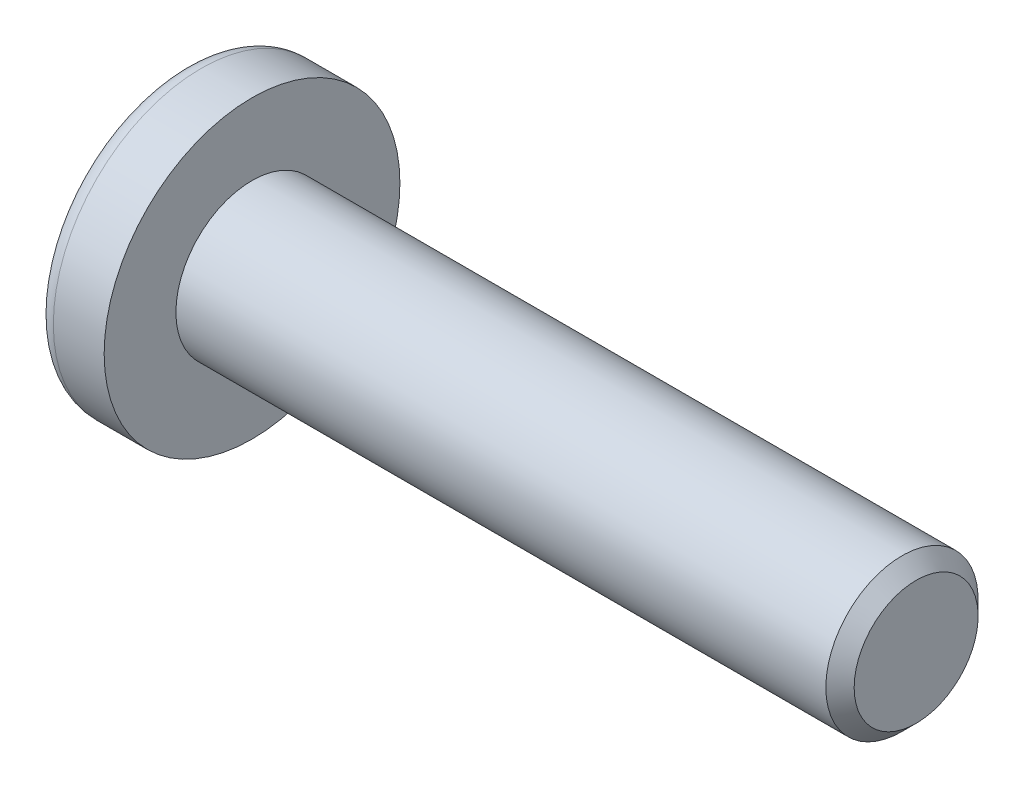
ISO-10303-21;
HEADER;
FILE_DESCRIPTION(('STEP AP214'),'2;1');
FILE_NAME('part.step','',(''),(''),'','','');
FILE_SCHEMA(('AUTOMOTIVE_DESIGN { 1 0 10303 214 1 1 1 1 }'));
ENDSEC;
DATA;
#1=APPLICATION_CONTEXT('core data for automotive mechanical design processes');
#2=APPLICATION_PROTOCOL_DEFINITION('international standard','automotive_design',2000,#1);
#3=PRODUCT_CONTEXT('',#1,'mechanical');
#4=PRODUCT('Part','Part','',(#3));
#5=PRODUCT_RELATED_PRODUCT_CATEGORY('part','',(#4));
#6=PRODUCT_DEFINITION_FORMATION('','',#4);
#7=PRODUCT_DEFINITION_CONTEXT('part definition',#1,'design');
#8=PRODUCT_DEFINITION('design','',#6,#7);
#9=PRODUCT_DEFINITION_SHAPE('','',#8);
#10=(LENGTH_UNIT() NAMED_UNIT(*) SI_UNIT(.MILLI.,.METRE.));
#11=(NAMED_UNIT(*) PLANE_ANGLE_UNIT() SI_UNIT($,.RADIAN.));
#12=(NAMED_UNIT(*) SI_UNIT($,.STERADIAN.) SOLID_ANGLE_UNIT());
#13=UNCERTAINTY_MEASURE_WITH_UNIT(LENGTH_MEASURE(1.E-05),#10,'distance_accuracy_value','');
#14=(GEOMETRIC_REPRESENTATION_CONTEXT(3) GLOBAL_UNCERTAINTY_ASSIGNED_CONTEXT((#13)) GLOBAL_UNIT_ASSIGNED_CONTEXT((#10,
#11,#12)) REPRESENTATION_CONTEXT('',''));
#15=CARTESIAN_POINT('',(0.,0.,0.));
#16=DIRECTION('',(0.,0.,1.));
#17=DIRECTION('',(1.,0.,0.));
#18=AXIS2_PLACEMENT_3D('',#15,#16,#17);
#19=CARTESIAN_POINT('',(3.49504,0.,0.));
#20=DIRECTION('',(-1.,0.,0.));
#21=DIRECTION('',(0.,1.,0.));
#22=AXIS2_PLACEMENT_3D('',#19,#20,#21);
#23=SPHERICAL_SURFACE('',#22,3.49504);
#24=CARTESIAN_POINT('',(0.638066947960321,0.,0.));
#25=DIRECTION('',(-1.,0.,0.));
#26=DIRECTION('',(0.,0.,1.));
#27=AXIS2_PLACEMENT_3D('',#24,#25,#26);
#28=CIRCLE('',#27,2.01320877742947);
#29=CARTESIAN_POINT('',(0.638066947960321,0.,2.01320877742947));
#30=VERTEX_POINT('',#29);
#31=EDGE_CURVE('E135',#30,#30,#28,.T.);
#32=ORIENTED_EDGE('',*,*,#31,.T.);
#33=EDGE_LOOP('',(#32));
#34=FACE_BOUND('',#33,.T.);
#35=CARTESIAN_POINT('',(3.48860800425343,-0.0562204072662827,0.));
#36=DIRECTION('',(-0.113665320353011,-0.99351909641891,0.));
#37=DIRECTION('',(0.99351909641891,-0.113665320353011,0.));
#38=AXIS2_PLACEMENT_3D('',#35,#36,#37);
#39=CIRCLE('',#38,3.49458187725478);
#40=CARTESIAN_POINT('',(0.227775025036725,0.316840992898337,1.19995665346604));
#41=VERTEX_POINT('',#40);
#42=CARTESIAN_POINT('',(0.033060362162214,0.339117670430593,0.339117670430593));
#43=VERTEX_POINT('',#42);
#44=EDGE_CURVE('E131',#41,#43,#39,.T.);
#45=ORIENTED_EDGE('',*,*,#44,.F.);
#46=CARTESIAN_POINT('',(2.78874832810788,0.,-0.872695468934767));
#47=DIRECTION('',(0.629103472698606,0.,0.777321568360582));
#48=DIRECTION('',(0.777321568360582,0.,-0.629103472698606));
#49=AXIS2_PLACEMENT_3D('',#46,#47,#48);
#50=CIRCLE('',#49,3.30981257691679);
#51=CARTESIAN_POINT('',(0.227775025036724,-0.316840992898345,1.19995665346604));
#52=VERTEX_POINT('',#51);
#53=EDGE_CURVE('E123',#41,#52,#50,.T.);
#54=ORIENTED_EDGE('',*,*,#53,.T.);
#55=CARTESIAN_POINT('',(3.48860800425343,0.0562204072662818,0.));
#56=DIRECTION('',(-0.11366532035301,0.99351909641891,0.));
#57=DIRECTION('',(-0.99351909641891,-0.11366532035301,0.));
#58=AXIS2_PLACEMENT_3D('',#55,#56,#57);
#59=CIRCLE('',#58,3.49458187725478);
#60=CARTESIAN_POINT('',(0.0330603621622127,-0.339117670430595,0.339117670430594));
#61=VERTEX_POINT('',#60);
#62=EDGE_CURVE('E374',#61,#52,#59,.T.);
#63=ORIENTED_EDGE('',*,*,#62,.F.);
#64=CARTESIAN_POINT('',(3.48860800425343,0.,-0.0562204072662819));
#65=DIRECTION('',(-0.11366532035301,0.,-0.99351909641891));
#66=DIRECTION('',(-0.99351909641891,0.,0.11366532035301));
#67=AXIS2_PLACEMENT_3D('',#64,#65,#66);
#68=CIRCLE('',#67,3.49458187725478);
#69=CARTESIAN_POINT('',(0.227775025036724,-1.19995665346604,0.316840992898341));
#70=VERTEX_POINT('',#69);
#71=EDGE_CURVE('E169',#70,#61,#68,.T.);
#72=ORIENTED_EDGE('',*,*,#71,.F.);
#73=CARTESIAN_POINT('',(2.78874832810788,0.872695468934764,0.));
#74=DIRECTION('',(0.629103472698606,-0.777321568360582,0.));
#75=DIRECTION('',(0.777321568360582,0.629103472698606,0.));
#76=AXIS2_PLACEMENT_3D('',#73,#74,#75);
#77=CIRCLE('',#76,3.30981257691679);
#78=CARTESIAN_POINT('',(0.227775025036722,-1.19995665346604,-0.316840992898341));
#79=VERTEX_POINT('',#78);
#80=EDGE_CURVE('E165',#70,#79,#77,.T.);
#81=ORIENTED_EDGE('',*,*,#80,.T.);
#82=CARTESIAN_POINT('',(3.48860800425343,0.,0.0562204072662826));
#83=DIRECTION('',(-0.113665320353011,0.,0.99351909641891));
#84=DIRECTION('',(0.99351909641891,0.,0.113665320353011));
#85=AXIS2_PLACEMENT_3D('',#82,#83,#84);
#86=CIRCLE('',#85,3.49458187725478);
#87=CARTESIAN_POINT('',(0.0330603621622127,-0.339117670430592,-0.339117670430594));
#88=VERTEX_POINT('',#87);
#89=EDGE_CURVE('E49',#88,#79,#86,.T.);
#90=ORIENTED_EDGE('',*,*,#89,.F.);
#91=CARTESIAN_POINT('',(0.227775025036724,-0.316840992898336,-1.19995665346604));
#92=VERTEX_POINT('',#91);
#93=EDGE_CURVE('E372',#92,#88,#59,.T.);
#94=ORIENTED_EDGE('',*,*,#93,.F.);
#95=CARTESIAN_POINT('',(2.78874832810788,0.,0.872695468934766));
#96=DIRECTION('',(0.629103472698606,0.,-0.777321568360582));
#97=DIRECTION('',(-0.777321568360582,0.,-0.629103472698606));
#98=AXIS2_PLACEMENT_3D('',#95,#96,#97);
#99=CIRCLE('',#98,3.30981257691679);
#100=CARTESIAN_POINT('',(0.227775025036724,0.316840992898345,-1.19995665346604));
#101=VERTEX_POINT('',#100);
#102=EDGE_CURVE('E379',#92,#101,#99,.T.);
#103=ORIENTED_EDGE('',*,*,#102,.T.);
#104=CARTESIAN_POINT('',(0.033060362162214,0.339117670430595,-0.339117670430594));
#105=VERTEX_POINT('',#104);
#106=EDGE_CURVE('E108',#105,#101,#39,.T.);
#107=ORIENTED_EDGE('',*,*,#106,.F.);
#108=CARTESIAN_POINT('',(0.227775025036726,1.19995665346604,-0.316840992898341));
#109=VERTEX_POINT('',#108);
#110=EDGE_CURVE('E130',#109,#105,#86,.T.);
#111=ORIENTED_EDGE('',*,*,#110,.F.);
#112=CARTESIAN_POINT('',(2.78874832810788,-0.872695468934769,0.));
#113=DIRECTION('',(0.629103472698606,0.777321568360582,0.));
#114=DIRECTION('',(-0.777321568360582,0.629103472698606,0.));
#115=AXIS2_PLACEMENT_3D('',#112,#113,#114);
#116=CIRCLE('',#115,3.30981257691679);
#117=CARTESIAN_POINT('',(0.227775025036726,1.19995665346604,0.31684099289834));
#118=VERTEX_POINT('',#117);
#119=EDGE_CURVE('E57',#109,#118,#116,.T.);
#120=ORIENTED_EDGE('',*,*,#119,.T.);
#121=EDGE_CURVE('E168',#43,#118,#68,.T.);
#122=ORIENTED_EDGE('',*,*,#121,.F.);
#123=EDGE_LOOP('',(#45,#54,#63,#72,#81,#90,#94,#103,#107,#111,#120,#122));
#124=FACE_BOUND('',#123,.T.);
#125=ADVANCED_FACE('F34',(#34,#124),#23,.T.);
#126=CARTESIAN_POINT('',(1.71044397905759,0.,-0.147213612565445));
#127=DIRECTION('',(-0.113665320353011,0.,0.99351909641891));
#128=DIRECTION('',(0.99351909641891,0.,0.113665320353011));
#129=AXIS2_PLACEMENT_3D('',#126,#127,#128);
#130=PLANE('',#129);
#131=ORIENTED_EDGE('',*,*,#110,.T.);
#132=DIRECTION('',(0.987162587649563,-0.112938092654823,0.112938092654823));
#133=VECTOR('',#132,1.);
#134=CARTESIAN_POINT('',(1.72685656853982,0.145335901056886,-0.145335901056885));
#135=LINE('',#134,#133);
#136=CARTESIAN_POINT('',(1.4986,0.171450000000001,-0.17145));
#137=VERTEX_POINT('',#136);
#138=EDGE_CURVE('E106',#105,#137,#135,.T.);
#139=ORIENTED_EDGE('',*,*,#138,.T.);
#140=DIRECTION('',(0.774265880811046,-0.626630437436058,0.0885812660249925));
#141=VECTOR('',#140,1.);
#142=CARTESIAN_POINT('',(0.,1.3843,-0.3429));
#143=LINE('',#142,#141);
#144=EDGE_CURVE('E128',#109,#137,#143,.T.);
#145=ORIENTED_EDGE('',*,*,#144,.F.);
#146=EDGE_LOOP('',(#131,#139,#145));
#147=FACE_BOUND('',#146,.T.);
#148=ADVANCED_FACE('F127',(#147),#130,.T.);
#149=DIRECTION('',(0.774265880811046,0.626630437436058,0.0885812660249925));
#150=VECTOR('',#149,1.);
#151=CARTESIAN_POINT('',(0.,-1.3843,-0.3429));
#152=LINE('',#151,#150);
#153=CARTESIAN_POINT('',(1.4986,-0.17145,-0.17145));
#154=VERTEX_POINT('',#153);
#155=EDGE_CURVE('E150',#79,#154,#152,.T.);
#156=ORIENTED_EDGE('',*,*,#155,.T.);
#157=DIRECTION('',(-0.987162587649563,-0.112938092654822,-0.112938092654823));
#158=VECTOR('',#157,1.);
#159=CARTESIAN_POINT('',(1.72685656853982,-0.145335901056885,-0.145335901056885));
#160=LINE('',#159,#158);
#161=EDGE_CURVE('E363',#154,#88,#160,.T.);
#162=ORIENTED_EDGE('',*,*,#161,.T.);
#163=ORIENTED_EDGE('',*,*,#89,.T.);
#164=EDGE_LOOP('',(#156,#162,#163));
#165=FACE_BOUND('',#164,.T.);
#166=ADVANCED_FACE('F198',(#165),#130,.T.);
#167=CARTESIAN_POINT('',(1.71044397905759,0.,0.147213612565445));
#168=DIRECTION('',(-0.11366532035301,0.,-0.99351909641891));
#169=DIRECTION('',(-0.99351909641891,0.,0.11366532035301));
#170=AXIS2_PLACEMENT_3D('',#167,#168,#169);
#171=PLANE('',#170);
#172=DIRECTION('',(0.774265880811046,-0.626630437436058,-0.0885812660249922));
#173=VECTOR('',#172,1.);
#174=CARTESIAN_POINT('',(0.,1.3843,0.342899999999999));
#175=LINE('',#174,#173);
#176=CARTESIAN_POINT('',(1.4986,0.17145,0.17145));
#177=VERTEX_POINT('',#176);
#178=EDGE_CURVE('E136',#118,#177,#175,.T.);
#179=ORIENTED_EDGE('',*,*,#178,.T.);
#180=DIRECTION('',(-0.987162587649563,0.112938092654822,0.112938092654822));
#181=VECTOR('',#180,1.);
#182=CARTESIAN_POINT('',(1.72685656853981,0.145335901056885,0.145335901056886));
#183=LINE('',#182,#181);
#184=EDGE_CURVE('E369',#177,#43,#183,.T.);
#185=ORIENTED_EDGE('',*,*,#184,.T.);
#186=ORIENTED_EDGE('',*,*,#121,.T.);
#187=EDGE_LOOP('',(#179,#185,#186));
#188=FACE_BOUND('',#187,.T.);
#189=ADVANCED_FACE('F229',(#188),#171,.T.);
#190=ORIENTED_EDGE('',*,*,#71,.T.);
#191=DIRECTION('',(0.987162587649563,0.112938092654823,-0.112938092654822));
#192=VECTOR('',#191,1.);
#193=CARTESIAN_POINT('',(1.72685656853982,-0.145335901056886,0.145335901056886));
#194=LINE('',#193,#192);
#195=CARTESIAN_POINT('',(1.4986,-0.171450000000001,0.171449999999999));
#196=VERTEX_POINT('',#195);
#197=EDGE_CURVE('E376',#61,#196,#194,.T.);
#198=ORIENTED_EDGE('',*,*,#197,.T.);
#199=DIRECTION('',(0.774265880811046,0.626630437436058,-0.0885812660249922));
#200=VECTOR('',#199,1.);
#201=CARTESIAN_POINT('',(0.,-1.3843,0.342899999999999));
#202=LINE('',#201,#200);
#203=EDGE_CURVE('E147',#70,#196,#202,.T.);
#204=ORIENTED_EDGE('',*,*,#203,.F.);
#205=EDGE_LOOP('',(#190,#198,#204));
#206=FACE_BOUND('',#205,.T.);
#207=ADVANCED_FACE('F218',(#206),#171,.T.);
#208=CARTESIAN_POINT('',(-25.4,0.,0.));
#209=DIRECTION('',(-1.,0.,0.));
#210=DIRECTION('',(0.,0.,1.));
#211=AXIS2_PLACEMENT_3D('',#208,#209,#210);
#212=CYLINDRICAL_SURFACE('',#211,1.0922);
#213=CARTESIAN_POINT('',(10.8966,0.,0.));
#214=DIRECTION('',(1.,0.,0.));
#215=DIRECTION('',(0.,0.,-1.));
#216=AXIS2_PLACEMENT_3D('',#213,#214,#215);
#217=CIRCLE('',#216,1.0922);
#218=CARTESIAN_POINT('',(10.8966,0.,1.0922));
#219=VERTEX_POINT('',#218);
#220=EDGE_CURVE('E42',#219,#219,#217,.F.);
#221=ORIENTED_EDGE('',*,*,#220,.T.);
#222=EDGE_LOOP('',(#221));
#223=FACE_BOUND('',#222,.T.);
#224=CARTESIAN_POINT('',(1.5748,0.,0.));
#225=DIRECTION('',(-1.,0.,0.));
#226=DIRECTION('',(0.,0.,1.));
#227=AXIS2_PLACEMENT_3D('',#224,#225,#226);
#228=CIRCLE('',#227,1.0922);
#229=CARTESIAN_POINT('',(1.5748,0.,1.0922));
#230=VERTEX_POINT('',#229);
#231=EDGE_CURVE('E162',#230,#230,#228,.T.);
#232=ORIENTED_EDGE('',*,*,#231,.F.);
#233=EDGE_LOOP('',(#232));
#234=FACE_BOUND('',#233,.T.);
#235=ADVANCED_FACE('F36',(#223,#234),#212,.T.);
#236=CARTESIAN_POINT('',(1.5748,1.0922,0.));
#237=DIRECTION('',(-1.,0.,0.));
#238=DIRECTION('',(0.,0.,1.));
#239=AXIS2_PLACEMENT_3D('',#236,#237,#238);
#240=PLANE('',#239);
#241=CARTESIAN_POINT('',(1.5748,0.,0.));
#242=DIRECTION('',(-1.,0.,0.));
#243=DIRECTION('',(0.,0.,1.));
#244=AXIS2_PLACEMENT_3D('',#241,#242,#243);
#245=CIRCLE('',#244,2.1209);
#246=CARTESIAN_POINT('',(1.5748,0.,2.1209));
#247=VERTEX_POINT('',#246);
#248=EDGE_CURVE('E159',#247,#247,#245,.T.);
#249=ORIENTED_EDGE('',*,*,#248,.F.);
#250=EDGE_LOOP('',(#249));
#251=FACE_BOUND('',#250,.T.);
#252=ORIENTED_EDGE('',*,*,#231,.T.);
#253=EDGE_LOOP('',(#252));
#254=FACE_BOUND('',#253,.T.);
#255=ADVANCED_FACE('F211',(#251,#254),#240,.F.);
#256=CARTESIAN_POINT('',(-25.4,0.,0.));
#257=DIRECTION('',(-1.,0.,0.));
#258=DIRECTION('',(0.,0.,1.));
#259=AXIS2_PLACEMENT_3D('',#256,#257,#258);
#260=CYLINDRICAL_SURFACE('',#259,2.1209);
#261=ORIENTED_EDGE('',*,*,#248,.T.);
#262=EDGE_LOOP('',(#261));
#263=FACE_BOUND('',#262,.T.);
#264=CARTESIAN_POINT('',(0.845695803486458,0.,0.));
#265=DIRECTION('',(-1.,0.,0.));
#266=DIRECTION('',(0.,0.,1.));
#267=AXIS2_PLACEMENT_3D('',#264,#265,#266);
#268=CIRCLE('',#267,2.1209);
#269=CARTESIAN_POINT('',(0.845695803486458,0.,2.1209));
#270=VERTEX_POINT('',#269);
#271=EDGE_CURVE('E156',#270,#270,#268,.T.);
#272=ORIENTED_EDGE('',*,*,#271,.F.);
#273=EDGE_LOOP('',(#272));
#274=FACE_BOUND('',#273,.T.);
#275=ADVANCED_FACE('F208',(#263,#274),#260,.T.);
#276=CARTESIAN_POINT('',(0.845695803486459,0.,0.));
#277=DIRECTION('',(-1.,0.,0.));
#278=DIRECTION('',(0.,0.,1.));
#279=AXIS2_PLACEMENT_3D('',#276,#277,#278);
#280=TOROIDAL_SURFACE('',#279,1.8669,0.254000000000001);
#281=ORIENTED_EDGE('',*,*,#271,.T.);
#282=EDGE_LOOP('',(#281));
#283=FACE_BOUND('',#282,.T.);
#284=ORIENTED_EDGE('',*,*,#31,.F.);
#285=EDGE_LOOP('',(#284));
#286=FACE_BOUND('',#285,.T.);
#287=ADVANCED_FACE('F205',(#283,#286),#280,.T.);
#288=CARTESIAN_POINT('',(11.0998,1.0922,0.));
#289=DIRECTION('',(1.,0.,0.));
#290=DIRECTION('',(0.,0.,-1.));
#291=AXIS2_PLACEMENT_3D('',#288,#289,#290);
#292=PLANE('',#291);
#293=CARTESIAN_POINT('',(11.0998,0.,0.));
#294=DIRECTION('',(1.,0.,0.));
#295=DIRECTION('',(0.,0.,-1.));
#296=AXIS2_PLACEMENT_3D('',#293,#294,#295);
#297=CIRCLE('',#296,0.888999999999997);
#298=CARTESIAN_POINT('',(11.0998,0.,0.888999999999998));
#299=VERTEX_POINT('',#298);
#300=EDGE_CURVE('E11',#299,#299,#297,.T.);
#301=ORIENTED_EDGE('',*,*,#300,.T.);
#302=EDGE_LOOP('',(#301));
#303=FACE_BOUND('',#302,.T.);
#304=ADVANCED_FACE('F203',(#303),#292,.T.);
#305=CARTESIAN_POINT('',(1.4986,0.17145,0.17145));
#306=DIRECTION('',(0.629103472698606,0.777321568360582,0.));
#307=DIRECTION('',(-0.777321568360582,0.629103472698606,0.));
#308=AXIS2_PLACEMENT_3D('',#305,#306,#307);
#309=PLANE('',#308);
#310=ORIENTED_EDGE('',*,*,#144,.T.);
#311=DIRECTION('',(0.,0.,-1.));
#312=VECTOR('',#311,1.);
#313=CARTESIAN_POINT('',(1.4986,0.17145,0.17145));
#314=LINE('',#313,#312);
#315=EDGE_CURVE('E122',#177,#137,#314,.T.);
#316=ORIENTED_EDGE('',*,*,#315,.F.);
#317=ORIENTED_EDGE('',*,*,#178,.F.);
#318=ORIENTED_EDGE('',*,*,#119,.F.);
#319=EDGE_LOOP('',(#310,#316,#317,#318));
#320=FACE_BOUND('',#319,.T.);
#321=ADVANCED_FACE('F134',(#320),#309,.F.);
#322=CARTESIAN_POINT('',(0.,-1.3843,-0.3429));
#323=DIRECTION('',(0.629103472698606,-0.777321568360582,0.));
#324=DIRECTION('',(0.777321568360582,0.629103472698606,0.));
#325=AXIS2_PLACEMENT_3D('',#322,#323,#324);
#326=PLANE('',#325);
#327=ORIENTED_EDGE('',*,*,#203,.T.);
#328=DIRECTION('',(0.,0.,1.));
#329=VECTOR('',#328,1.);
#330=CARTESIAN_POINT('',(1.4986,-0.17145,-0.17145));
#331=LINE('',#330,#329);
#332=EDGE_CURVE('E143',#154,#196,#331,.T.);
#333=ORIENTED_EDGE('',*,*,#332,.F.);
#334=ORIENTED_EDGE('',*,*,#155,.F.);
#335=ORIENTED_EDGE('',*,*,#80,.F.);
#336=EDGE_LOOP('',(#327,#333,#334,#335));
#337=FACE_BOUND('',#336,.T.);
#338=ADVANCED_FACE('F237',(#337),#326,.F.);
#339=CARTESIAN_POINT('',(1.4986,0.17145,-0.17145));
#340=DIRECTION('',(-1.,0.,0.));
#341=DIRECTION('',(0.,0.,1.));
#342=AXIS2_PLACEMENT_3D('',#339,#340,#341);
#343=PLANE('',#342);
#344=DIRECTION('',(0.,1.,0.));
#345=VECTOR('',#344,1.);
#346=CARTESIAN_POINT('',(1.4986,-0.17145,-0.17145));
#347=LINE('',#346,#345);
#348=EDGE_CURVE('E115',#154,#137,#347,.T.);
#349=ORIENTED_EDGE('',*,*,#348,.F.);
#350=ORIENTED_EDGE('',*,*,#332,.T.);
#351=DIRECTION('',(0.,-1.,0.));
#352=VECTOR('',#351,1.);
#353=CARTESIAN_POINT('',(1.4986,0.17145,0.17145));
#354=LINE('',#353,#352);
#355=EDGE_CURVE('E141',#177,#196,#354,.T.);
#356=ORIENTED_EDGE('',*,*,#355,.F.);
#357=ORIENTED_EDGE('',*,*,#315,.T.);
#358=EDGE_LOOP('',(#349,#350,#356,#357));
#359=FACE_BOUND('',#358,.T.);
#360=ADVANCED_FACE('F139',(#359),#343,.T.);
#361=CARTESIAN_POINT('',(0.,0.342900000000005,-1.3843));
#362=DIRECTION('',(0.629103472698606,0.,-0.777321568360582));
#363=DIRECTION('',(0.777321568360582,0.,0.629103472698606));
#364=AXIS2_PLACEMENT_3D('',#361,#362,#363);
#365=PLANE('',#364);
#366=DIRECTION('',(0.774265880811046,0.08858126602499,0.626630437436058));
#367=VECTOR('',#366,1.);
#368=CARTESIAN_POINT('',(0.,-0.342899999999994,-1.3843));
#369=LINE('',#368,#367);
#370=EDGE_CURVE('E112',#92,#154,#369,.T.);
#371=ORIENTED_EDGE('',*,*,#370,.T.);
#372=ORIENTED_EDGE('',*,*,#348,.T.);
#373=DIRECTION('',(0.774265880811046,-0.0885812660249947,0.626630437436057));
#374=VECTOR('',#373,1.);
#375=CARTESIAN_POINT('',(0.,0.342900000000005,-1.3843));
#376=LINE('',#375,#374);
#377=EDGE_CURVE('E102',#101,#137,#376,.T.);
#378=ORIENTED_EDGE('',*,*,#377,.F.);
#379=ORIENTED_EDGE('',*,*,#102,.F.);
#380=EDGE_LOOP('',(#371,#372,#378,#379));
#381=FACE_BOUND('',#380,.T.);
#382=ADVANCED_FACE('F116',(#381),#365,.F.);
#383=CARTESIAN_POINT('',(1.71044397905759,-0.147213612565445,0.));
#384=DIRECTION('',(-0.11366532035301,0.99351909641891,0.));
#385=DIRECTION('',(-0.99351909641891,-0.11366532035301,0.));
#386=AXIS2_PLACEMENT_3D('',#383,#384,#385);
#387=PLANE('',#386);
#388=ORIENTED_EDGE('',*,*,#93,.T.);
#389=ORIENTED_EDGE('',*,*,#161,.F.);
#390=ORIENTED_EDGE('',*,*,#370,.F.);
#391=EDGE_LOOP('',(#388,#389,#390));
#392=FACE_BOUND('',#391,.T.);
#393=ADVANCED_FACE('F189',(#392),#387,.T.);
#394=CARTESIAN_POINT('',(1.71044397905759,0.147213612565445,0.));
#395=DIRECTION('',(-0.113665320353011,-0.99351909641891,0.));
#396=DIRECTION('',(0.99351909641891,-0.113665320353011,0.));
#397=AXIS2_PLACEMENT_3D('',#394,#395,#396);
#398=PLANE('',#397);
#399=ORIENTED_EDGE('',*,*,#106,.T.);
#400=ORIENTED_EDGE('',*,*,#377,.T.);
#401=ORIENTED_EDGE('',*,*,#138,.F.);
#402=EDGE_LOOP('',(#399,#400,#401));
#403=FACE_BOUND('',#402,.T.);
#404=ADVANCED_FACE('F104',(#403),#398,.T.);
#405=CARTESIAN_POINT('',(1.4986,-0.171450000000001,0.171449999999999));
#406=DIRECTION('',(0.629103472698606,0.,0.777321568360582));
#407=DIRECTION('',(-0.777321568360582,0.,0.629103472698606));
#408=AXIS2_PLACEMENT_3D('',#405,#406,#407);
#409=PLANE('',#408);
#410=DIRECTION('',(0.774265880811046,-0.0885812660249903,-0.626630437436058));
#411=VECTOR('',#410,1.);
#412=CARTESIAN_POINT('',(0.,0.342899999999995,1.3843));
#413=LINE('',#412,#411);
#414=EDGE_CURVE('E381',#41,#177,#413,.T.);
#415=ORIENTED_EDGE('',*,*,#414,.T.);
#416=ORIENTED_EDGE('',*,*,#355,.T.);
#417=DIRECTION('',(0.774265880811046,0.0885812660249944,-0.626630437436058));
#418=VECTOR('',#417,1.);
#419=CARTESIAN_POINT('',(0.,-0.342900000000004,1.3843));
#420=LINE('',#419,#418);
#421=EDGE_CURVE('E111',#52,#196,#420,.T.);
#422=ORIENTED_EDGE('',*,*,#421,.F.);
#423=ORIENTED_EDGE('',*,*,#53,.F.);
#424=EDGE_LOOP('',(#415,#416,#422,#423));
#425=FACE_BOUND('',#424,.T.);
#426=ADVANCED_FACE('F282',(#425),#409,.F.);
#427=ORIENTED_EDGE('',*,*,#44,.T.);
#428=ORIENTED_EDGE('',*,*,#184,.F.);
#429=ORIENTED_EDGE('',*,*,#414,.F.);
#430=EDGE_LOOP('',(#427,#428,#429));
#431=FACE_BOUND('',#430,.T.);
#432=ADVANCED_FACE('F186',(#431),#398,.T.);
#433=ORIENTED_EDGE('',*,*,#62,.T.);
#434=ORIENTED_EDGE('',*,*,#421,.T.);
#435=ORIENTED_EDGE('',*,*,#197,.F.);
#436=EDGE_LOOP('',(#433,#434,#435));
#437=FACE_BOUND('',#436,.T.);
#438=ADVANCED_FACE('F180',(#437),#387,.T.);
#439=CARTESIAN_POINT('',(10.8966,0.,0.));
#440=DIRECTION('',(-1.,0.,0.));
#441=DIRECTION('',(0.,0.,1.));
#442=AXIS2_PLACEMENT_3D('',#439,#440,#441);
#443=CONICAL_SURFACE('',#442,1.0922,0.785398163397436);
#444=CARTESIAN_POINT('',(11.0998,0.,0.888999999999998));
#445=CARTESIAN_POINT('',(11.0976833333333,0.,0.891116666666665));
#446=CARTESIAN_POINT('',(11.0955666666667,0.,0.893233333333332));
#447=CARTESIAN_POINT('',(11.0913333333333,0.,0.897466666666665));
#448=CARTESIAN_POINT('',(11.0892166666667,0.,0.899583333333332));
#449=CARTESIAN_POINT('',(11.0849833333333,0.,0.903816666666665));
#450=CARTESIAN_POINT('',(11.0828666666667,0.,0.905933333333332));
#451=CARTESIAN_POINT('',(11.0786333333333,0.,0.910166666666665));
#452=CARTESIAN_POINT('',(11.0765166666667,0.,0.912283333333332));
#453=CARTESIAN_POINT('',(11.0722833333333,0.,0.916516666666665));
#454=CARTESIAN_POINT('',(11.0701666666667,0.,0.918633333333332));
#455=CARTESIAN_POINT('',(11.0659333333333,0.,0.922866666666665));
#456=CARTESIAN_POINT('',(11.0638166666667,0.,0.924983333333332));
#457=CARTESIAN_POINT('',(11.0595833333333,0.,0.929216666666665));
#458=CARTESIAN_POINT('',(11.0574666666667,0.,0.931333333333332));
#459=CARTESIAN_POINT('',(11.0532333333333,0.,0.935566666666666));
#460=CARTESIAN_POINT('',(11.0511166666667,0.,0.937683333333332));
#461=CARTESIAN_POINT('',(11.0468833333333,0.,0.941916666666665));
#462=CARTESIAN_POINT('',(11.0447666666667,0.,0.944033333333332));
#463=CARTESIAN_POINT('',(11.0405333333333,0.,0.948266666666666));
#464=CARTESIAN_POINT('',(11.0384166666667,0.,0.950383333333332));
#465=CARTESIAN_POINT('',(11.0341833333333,0.,0.954616666666666));
#466=CARTESIAN_POINT('',(11.0320666666667,0.,0.956733333333332));
#467=CARTESIAN_POINT('',(11.0278333333333,0.,0.960966666666666));
#468=CARTESIAN_POINT('',(11.0257166666667,0.,0.963083333333333));
#469=CARTESIAN_POINT('',(11.0214833333333,0.,0.967316666666666));
#470=CARTESIAN_POINT('',(11.0193666666667,0.,0.969433333333332));
#471=CARTESIAN_POINT('',(11.0151333333333,0.,0.973666666666666));
#472=CARTESIAN_POINT('',(11.0130166666667,0.,0.975783333333333));
#473=CARTESIAN_POINT('',(11.0087833333333,0.,0.980016666666666));
#474=CARTESIAN_POINT('',(11.0066666666667,0.,0.982133333333333));
#475=CARTESIAN_POINT('',(11.0024333333333,0.,0.986366666666666));
#476=CARTESIAN_POINT('',(11.0003166666667,0.,0.988483333333333));
#477=CARTESIAN_POINT('',(10.9960833333333,0.,0.992716666666666));
#478=CARTESIAN_POINT('',(10.9939666666667,0.,0.994833333333333));
#479=CARTESIAN_POINT('',(10.9897333333333,0.,0.999066666666666));
#480=CARTESIAN_POINT('',(10.9876166666667,0.,1.00118333333333));
#481=CARTESIAN_POINT('',(10.9833833333333,0.,1.00541666666667));
#482=CARTESIAN_POINT('',(10.9812666666667,0.,1.00753333333333));
#483=CARTESIAN_POINT('',(10.9770333333333,0.,1.01176666666667));
#484=CARTESIAN_POINT('',(10.9749166666667,0.,1.01388333333333));
#485=CARTESIAN_POINT('',(10.9706833333333,0.,1.01811666666667));
#486=CARTESIAN_POINT('',(10.9685666666667,0.,1.02023333333333));
#487=CARTESIAN_POINT('',(10.9643333333333,0.,1.02446666666667));
#488=CARTESIAN_POINT('',(10.9622166666667,0.,1.02658333333333));
#489=CARTESIAN_POINT('',(10.9579833333333,0.,1.03081666666667));
#490=CARTESIAN_POINT('',(10.9558666666667,0.,1.03293333333333));
#491=CARTESIAN_POINT('',(10.9516333333333,0.,1.03716666666667));
#492=CARTESIAN_POINT('',(10.9495166666667,0.,1.03928333333333));
#493=CARTESIAN_POINT('',(10.9452833333333,0.,1.04351666666667));
#494=CARTESIAN_POINT('',(10.9431666666667,0.,1.04563333333333));
#495=CARTESIAN_POINT('',(10.9389333333333,0.,1.04986666666667));
#496=CARTESIAN_POINT('',(10.9368166666667,0.,1.05198333333333));
#497=CARTESIAN_POINT('',(10.9325833333333,0.,1.05621666666667));
#498=CARTESIAN_POINT('',(10.9304666666667,0.,1.05833333333333));
#499=CARTESIAN_POINT('',(10.9262333333333,0.,1.06256666666667));
#500=CARTESIAN_POINT('',(10.9241166666667,0.,1.06468333333333));
#501=CARTESIAN_POINT('',(10.9198833333333,0.,1.06891666666667));
#502=CARTESIAN_POINT('',(10.9177666666667,0.,1.07103333333333));
#503=CARTESIAN_POINT('',(10.9135333333333,0.,1.07526666666667));
#504=CARTESIAN_POINT('',(10.9114166666667,0.,1.07738333333333));
#505=CARTESIAN_POINT('',(10.9071833333333,0.,1.08161666666667));
#506=CARTESIAN_POINT('',(10.9050666666667,0.,1.08373333333333));
#507=CARTESIAN_POINT('',(10.9008333333333,0.,1.08796666666667));
#508=CARTESIAN_POINT('',(10.8987166666667,0.,1.09008333333333));
#509=CARTESIAN_POINT('',(10.8966,0.,1.0922));
#510=B_SPLINE_CURVE_WITH_KNOTS('',3,(#444,#445,#446,#447,#448,#449,#450,#451,#452,#453,#454,
#455,#456,#457,#458,#459,#460,#461,#462,#463,#464,#465,#466,#467,#468,#469,#470,#471,#472,#473,
#474,#475,#476,#477,#478,#479,#480,#481,#482,#483,#484,#485,#486,#487,#488,#489,#490,#491,#492,
#493,#494,#495,#496,#497,#498,#499,#500,#501,#502,#503,#504,#505,#506,#507,#508,#509),
.UNSPECIFIED.,.F.,.F.,(4,2,2,2,2,2,2,2,2,2,2,2,2,2,2,2,2,2,2,2,2,2,2,2,2,2,2,2,2,2,2,2,4),(0.,
0.00898025612106826,0.0179605122421378,0.0269407683632074,0.0359210244842769,0.0449012806053464,
0.0538815367264159,0.0628617928474855,0.071842048968555,0.0808223050896232,0.0898025612106928,
0.0987828173317624,0.107763073452832,0.116743329573901,0.125723585694971,0.13470384181604,
0.14368409793711,0.152664354058178,0.161644610179248,0.170624866300317,0.179605122421387,
0.188585378542456,0.197565634663526,0.206545890784595,0.215526146905665,0.224506403026733,
0.233486659147803,0.242466915268872,0.251447171389942,0.260427427511011,0.269407683632081,
0.27838793975315,0.287368195874219),.UNSPECIFIED.);
#511=EDGE_CURVE('BSEAM178',#299,#219,#510,.T.);
#512=ORIENTED_EDGE('',*,*,#300,.F.);
#513=ORIENTED_EDGE('',*,*,#220,.F.);
#514=ORIENTED_EDGE('',*,*,#511,.T.);
#515=ORIENTED_EDGE('',*,*,#511,.F.);
#516=EDGE_LOOP('',(#512,#514,#513,#515));
#517=FACE_BOUND('',#516,.T.);
#518=ADVANCED_FACE('F178',(#517),#443,.T.);
#519=CLOSED_SHELL('',(#125,#148,#166,#189,#207,#235,#255,#275,#287,#304,#321,#338,#360,#382,
#393,#404,#426,#432,#438,#518));
#520=MANIFOLD_SOLID_BREP('B2',#519);
#521=ADVANCED_BREP_SHAPE_REPRESENTATION('',(#18,#520),#14);
#522=SHAPE_DEFINITION_REPRESENTATION(#9,#521);
ENDSEC;
END-ISO-10303-21;
